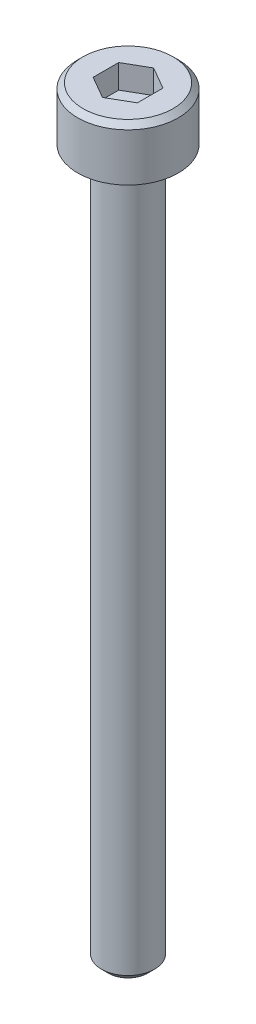
ISO-10303-21;
HEADER;
FILE_DESCRIPTION(('STEP AP214'),'2;1');
FILE_NAME('part.step','',(''),(''),'','','');
FILE_SCHEMA(('AUTOMOTIVE_DESIGN { 1 0 10303 214 1 1 1 1 }'));
ENDSEC;
DATA;
#1=APPLICATION_CONTEXT('core data for automotive mechanical design processes');
#2=APPLICATION_PROTOCOL_DEFINITION('international standard','automotive_design',2000,#1);
#3=PRODUCT_CONTEXT('',#1,'mechanical');
#4=PRODUCT('Part','Part','',(#3));
#5=PRODUCT_RELATED_PRODUCT_CATEGORY('part','',(#4));
#6=PRODUCT_DEFINITION_FORMATION('','',#4);
#7=PRODUCT_DEFINITION_CONTEXT('part definition',#1,'design');
#8=PRODUCT_DEFINITION('design','',#6,#7);
#9=PRODUCT_DEFINITION_SHAPE('','',#8);
#10=(LENGTH_UNIT() NAMED_UNIT(*) SI_UNIT(.MILLI.,.METRE.));
#11=(NAMED_UNIT(*) PLANE_ANGLE_UNIT() SI_UNIT($,.RADIAN.));
#12=(NAMED_UNIT(*) SI_UNIT($,.STERADIAN.) SOLID_ANGLE_UNIT());
#13=UNCERTAINTY_MEASURE_WITH_UNIT(LENGTH_MEASURE(1.E-05),#10,'distance_accuracy_value','');
#14=(GEOMETRIC_REPRESENTATION_CONTEXT(3) GLOBAL_UNCERTAINTY_ASSIGNED_CONTEXT((#13)) GLOBAL_UNIT_ASSIGNED_CONTEXT((#10,
#11,#12)) REPRESENTATION_CONTEXT('',''));
#15=CARTESIAN_POINT('',(0.,0.,0.));
#16=DIRECTION('',(0.,0.,1.));
#17=DIRECTION('',(1.,0.,0.));
#18=AXIS2_PLACEMENT_3D('',#15,#16,#17);
#19=CARTESIAN_POINT('',(0.,-40.,0.));
#20=DIRECTION('',(0.,-1.,0.));
#21=DIRECTION('',(0.,0.,-1.));
#22=AXIS2_PLACEMENT_3D('',#19,#20,#21);
#23=PLANE('',#22);
#24=CARTESIAN_POINT('',(0.,-40.,0.));
#25=DIRECTION('',(0.,-1.,0.));
#26=DIRECTION('',(0.,0.,-1.));
#27=AXIS2_PLACEMENT_3D('',#24,#25,#26);
#28=CIRCLE('',#27,1.1);
#29=CARTESIAN_POINT('',(0.,-40.,-1.1));
#30=VERTEX_POINT('',#29);
#31=EDGE_CURVE('E11',#30,#30,#28,.T.);
#32=ORIENTED_EDGE('',*,*,#31,.T.);
#33=EDGE_LOOP('',(#32));
#34=FACE_BOUND('',#33,.T.);
#35=ADVANCED_FACE('F41',(#34),#23,.T.);
#36=CARTESIAN_POINT('',(0.,-40.,0.));
#37=DIRECTION('',(0.,1.,0.));
#38=DIRECTION('',(0.,0.,1.));
#39=AXIS2_PLACEMENT_3D('',#36,#37,#38);
#40=CONICAL_SURFACE('',#39,1.1,0.785398163397451);
#41=CARTESIAN_POINT('',(0.,-39.6,0.));
#42=DIRECTION('',(0.,-1.,0.));
#43=DIRECTION('',(0.,0.,-1.));
#44=AXIS2_PLACEMENT_3D('',#41,#42,#43);
#45=CIRCLE('',#44,1.5);
#46=CARTESIAN_POINT('',(0.,-39.6,-1.5));
#47=VERTEX_POINT('',#46);
#48=EDGE_CURVE('E48',#47,#47,#45,.T.);
#49=ORIENTED_EDGE('',*,*,#48,.T.);
#50=EDGE_LOOP('',(#49));
#51=FACE_BOUND('',#50,.T.);
#52=ORIENTED_EDGE('',*,*,#31,.F.);
#53=EDGE_LOOP('',(#52));
#54=FACE_BOUND('',#53,.T.);
#55=ADVANCED_FACE('F161',(#51,#54),#40,.T.);
#56=CARTESIAN_POINT('',(0.,-10.,0.));
#57=DIRECTION('',(0.,-1.,0.));
#58=DIRECTION('',(0.,0.,-1.));
#59=AXIS2_PLACEMENT_3D('',#56,#57,#58);
#60=CYLINDRICAL_SURFACE('',#59,1.5);
#61=CARTESIAN_POINT('',(0.,0.,0.));
#62=DIRECTION('',(0.,-1.,0.));
#63=DIRECTION('',(0.,0.,-1.));
#64=AXIS2_PLACEMENT_3D('',#61,#62,#63);
#65=CIRCLE('',#64,1.5);
#66=CARTESIAN_POINT('',(0.,0.,-1.5));
#67=VERTEX_POINT('',#66);
#68=EDGE_CURVE('E156',#67,#67,#65,.T.);
#69=ORIENTED_EDGE('',*,*,#68,.T.);
#70=EDGE_LOOP('',(#69));
#71=FACE_BOUND('',#70,.T.);
#72=ORIENTED_EDGE('',*,*,#48,.F.);
#73=EDGE_LOOP('',(#72));
#74=FACE_BOUND('',#73,.T.);
#75=ADVANCED_FACE('F164',(#71,#74),#60,.T.);
#76=CARTESIAN_POINT('',(1.5,0.,0.));
#77=DIRECTION('',(0.,-1.,0.));
#78=DIRECTION('',(0.,0.,-1.));
#79=AXIS2_PLACEMENT_3D('',#76,#77,#78);
#80=PLANE('',#79);
#81=CARTESIAN_POINT('',(0.,0.,0.));
#82=DIRECTION('',(0.,-1.,0.));
#83=DIRECTION('',(0.,0.,-1.));
#84=AXIS2_PLACEMENT_3D('',#81,#82,#83);
#85=CIRCLE('',#84,2.84);
#86=CARTESIAN_POINT('',(0.,0.,-2.84));
#87=VERTEX_POINT('',#86);
#88=EDGE_CURVE('E153',#87,#87,#85,.T.);
#89=ORIENTED_EDGE('',*,*,#88,.T.);
#90=EDGE_LOOP('',(#89));
#91=FACE_BOUND('',#90,.T.);
#92=ORIENTED_EDGE('',*,*,#68,.F.);
#93=EDGE_LOOP('',(#92));
#94=FACE_BOUND('',#93,.T.);
#95=ADVANCED_FACE('F166',(#91,#94),#80,.T.);
#96=CARTESIAN_POINT('',(0.,-10.,0.));
#97=DIRECTION('',(0.,-1.,0.));
#98=DIRECTION('',(0.,0.,-1.));
#99=AXIS2_PLACEMENT_3D('',#96,#97,#98);
#100=CYLINDRICAL_SURFACE('',#99,2.84);
#101=CARTESIAN_POINT('',(0.,2.7,0.));
#102=DIRECTION('',(0.,-1.,0.));
#103=DIRECTION('',(0.,0.,-1.));
#104=AXIS2_PLACEMENT_3D('',#101,#102,#103);
#105=CIRCLE('',#104,2.84);
#106=CARTESIAN_POINT('',(0.,2.7,-2.84));
#107=VERTEX_POINT('',#106);
#108=EDGE_CURVE('E150',#107,#107,#105,.T.);
#109=ORIENTED_EDGE('',*,*,#108,.T.);
#110=EDGE_LOOP('',(#109));
#111=FACE_BOUND('',#110,.T.);
#112=ORIENTED_EDGE('',*,*,#88,.F.);
#113=EDGE_LOOP('',(#112));
#114=FACE_BOUND('',#113,.T.);
#115=ADVANCED_FACE('F172',(#111,#114),#100,.T.);
#116=CARTESIAN_POINT('',(0.,2.7,0.));
#117=DIRECTION('',(0.,-1.,0.));
#118=DIRECTION('',(0.,0.,-1.));
#119=AXIS2_PLACEMENT_3D('',#116,#117,#118);
#120=CONICAL_SURFACE('',#119,2.84,0.785398163397445);
#121=CARTESIAN_POINT('',(0.,3.,0.));
#122=DIRECTION('',(0.,-1.,0.));
#123=DIRECTION('',(0.,0.,-1.));
#124=AXIS2_PLACEMENT_3D('',#121,#122,#123);
#125=CIRCLE('',#124,2.54);
#126=CARTESIAN_POINT('',(0.,3.,-2.54));
#127=VERTEX_POINT('',#126);
#128=EDGE_CURVE('E142',#127,#127,#125,.T.);
#129=ORIENTED_EDGE('',*,*,#128,.T.);
#130=EDGE_LOOP('',(#129));
#131=FACE_BOUND('',#130,.T.);
#132=ORIENTED_EDGE('',*,*,#108,.F.);
#133=EDGE_LOOP('',(#132));
#134=FACE_BOUND('',#133,.T.);
#135=ADVANCED_FACE('F207',(#131,#134),#120,.T.);
#136=CARTESIAN_POINT('',(2.54,3.,0.));
#137=DIRECTION('',(0.,1.,0.));
#138=DIRECTION('',(0.,0.,1.));
#139=AXIS2_PLACEMENT_3D('',#136,#137,#138);
#140=PLANE('',#139);
#141=DIRECTION('',(0.,0.,-1.));
#142=VECTOR('',#141,1.);
#143=CARTESIAN_POINT('',(1.25,3.,-0.721687836487032));
#144=LINE('',#143,#142);
#145=CARTESIAN_POINT('',(1.25,3.,0.721687836487032));
#146=VERTEX_POINT('',#145);
#147=CARTESIAN_POINT('',(1.25,3.,-0.721687836487032));
#148=VERTEX_POINT('',#147);
#149=EDGE_CURVE('E55',#146,#148,#144,.T.);
#150=ORIENTED_EDGE('',*,*,#149,.F.);
#151=DIRECTION('',(0.866025403784439,0.,-0.5));
#152=VECTOR('',#151,1.);
#153=CARTESIAN_POINT('',(1.25,3.,0.721687836487032));
#154=LINE('',#153,#152);
#155=CARTESIAN_POINT('',(0.,3.,1.44337567297406));
#156=VERTEX_POINT('',#155);
#157=EDGE_CURVE('E138',#156,#146,#154,.T.);
#158=ORIENTED_EDGE('',*,*,#157,.F.);
#159=DIRECTION('',(0.866025403784439,0.,0.5));
#160=VECTOR('',#159,1.);
#161=CARTESIAN_POINT('',(0.,3.,1.44337567297406));
#162=LINE('',#161,#160);
#163=CARTESIAN_POINT('',(-1.25,3.,0.721687836487033));
#164=VERTEX_POINT('',#163);
#165=EDGE_CURVE('E136',#164,#156,#162,.T.);
#166=ORIENTED_EDGE('',*,*,#165,.F.);
#167=DIRECTION('',(0.,0.,1.));
#168=VECTOR('',#167,1.);
#169=CARTESIAN_POINT('',(-1.25,3.,0.721687836487033));
#170=LINE('',#169,#168);
#171=CARTESIAN_POINT('',(-1.25,3.,-0.721687836487032));
#172=VERTEX_POINT('',#171);
#173=EDGE_CURVE('E103',#172,#164,#170,.T.);
#174=ORIENTED_EDGE('',*,*,#173,.F.);
#175=DIRECTION('',(-0.866025403784438,0.,0.5));
#176=VECTOR('',#175,1.);
#177=CARTESIAN_POINT('',(-1.25,3.,-0.721687836487032));
#178=LINE('',#177,#176);
#179=CARTESIAN_POINT('',(0.,3.,-1.44337567297406));
#180=VERTEX_POINT('',#179);
#181=EDGE_CURVE('E132',#180,#172,#178,.T.);
#182=ORIENTED_EDGE('',*,*,#181,.F.);
#183=DIRECTION('',(-0.866025403784439,0.,-0.5));
#184=VECTOR('',#183,1.);
#185=CARTESIAN_POINT('',(0.,3.,-1.44337567297406));
#186=LINE('',#185,#184);
#187=EDGE_CURVE('E129',#148,#180,#186,.T.);
#188=ORIENTED_EDGE('',*,*,#187,.F.);
#189=EDGE_LOOP('',(#150,#158,#166,#174,#182,#188));
#190=FACE_BOUND('',#189,.T.);
#191=ORIENTED_EDGE('',*,*,#128,.F.);
#192=EDGE_LOOP('',(#191));
#193=FACE_BOUND('',#192,.T.);
#194=ADVANCED_FACE('F216',(#190,#193),#140,.T.);
#195=CARTESIAN_POINT('',(1.25,1.65,-0.721687836487032));
#196=DIRECTION('',(1.,0.,0.));
#197=DIRECTION('',(0.,0.,-1.));
#198=AXIS2_PLACEMENT_3D('',#195,#196,#197);
#199=PLANE('',#198);
#200=ORIENTED_EDGE('',*,*,#149,.T.);
#201=DIRECTION('',(0.,1.,0.));
#202=VECTOR('',#201,1.);
#203=CARTESIAN_POINT('',(1.25,1.65,-0.721687836487032));
#204=LINE('',#203,#202);
#205=CARTESIAN_POINT('',(1.25,1.65,-0.721687836487032));
#206=VERTEX_POINT('',#205);
#207=EDGE_CURVE('E85',#206,#148,#204,.T.);
#208=ORIENTED_EDGE('',*,*,#207,.F.);
#209=DIRECTION('',(0.,0.,-1.));
#210=VECTOR('',#209,1.);
#211=CARTESIAN_POINT('',(1.25,1.65,-0.721687836487032));
#212=LINE('',#211,#210);
#213=CARTESIAN_POINT('',(1.25,1.65,0.721687836487032));
#214=VERTEX_POINT('',#213);
#215=EDGE_CURVE('E140',#214,#206,#212,.T.);
#216=ORIENTED_EDGE('',*,*,#215,.F.);
#217=DIRECTION('',(0.,1.,0.));
#218=VECTOR('',#217,1.);
#219=CARTESIAN_POINT('',(1.25,1.65,0.721687836487032));
#220=LINE('',#219,#218);
#221=EDGE_CURVE('E63',#214,#146,#220,.T.);
#222=ORIENTED_EDGE('',*,*,#221,.T.);
#223=EDGE_LOOP('',(#200,#208,#216,#222));
#224=FACE_BOUND('',#223,.T.);
#225=ADVANCED_FACE('F225',(#224),#199,.F.);
#226=CARTESIAN_POINT('',(1.25,1.65,0.721687836487032));
#227=DIRECTION('',(0.5,0.,0.866025403784439));
#228=DIRECTION('',(0.866025403784439,0.,-0.5));
#229=AXIS2_PLACEMENT_3D('',#226,#227,#228);
#230=PLANE('',#229);
#231=ORIENTED_EDGE('',*,*,#157,.T.);
#232=ORIENTED_EDGE('',*,*,#221,.F.);
#233=DIRECTION('',(0.866025403784439,0.,-0.5));
#234=VECTOR('',#233,1.);
#235=CARTESIAN_POINT('',(1.25,1.65,0.721687836487032));
#236=LINE('',#235,#234);
#237=CARTESIAN_POINT('',(0.,1.65,1.44337567297406));
#238=VERTEX_POINT('',#237);
#239=EDGE_CURVE('E115',#238,#214,#236,.T.);
#240=ORIENTED_EDGE('',*,*,#239,.F.);
#241=DIRECTION('',(0.,1.,0.));
#242=VECTOR('',#241,1.);
#243=CARTESIAN_POINT('',(0.,1.65,1.44337567297406));
#244=LINE('',#243,#242);
#245=EDGE_CURVE('E107',#238,#156,#244,.T.);
#246=ORIENTED_EDGE('',*,*,#245,.T.);
#247=EDGE_LOOP('',(#231,#232,#240,#246));
#248=FACE_BOUND('',#247,.T.);
#249=ADVANCED_FACE('F234',(#248),#230,.F.);
#250=CARTESIAN_POINT('',(0.,1.65,1.44337567297406));
#251=DIRECTION('',(-0.5,0.,0.866025403784439));
#252=DIRECTION('',(0.866025403784439,0.,0.5));
#253=AXIS2_PLACEMENT_3D('',#250,#251,#252);
#254=PLANE('',#253);
#255=ORIENTED_EDGE('',*,*,#165,.T.);
#256=ORIENTED_EDGE('',*,*,#245,.F.);
#257=DIRECTION('',(0.866025403784439,0.,0.5));
#258=VECTOR('',#257,1.);
#259=CARTESIAN_POINT('',(0.,1.65,1.44337567297406));
#260=LINE('',#259,#258);
#261=CARTESIAN_POINT('',(-1.25,1.65,0.721687836487033));
#262=VERTEX_POINT('',#261);
#263=EDGE_CURVE('E111',#262,#238,#260,.T.);
#264=ORIENTED_EDGE('',*,*,#263,.F.);
#265=DIRECTION('',(0.,1.,0.));
#266=VECTOR('',#265,1.);
#267=CARTESIAN_POINT('',(-1.25,1.65,0.721687836487033));
#268=LINE('',#267,#266);
#269=EDGE_CURVE('E96',#262,#164,#268,.T.);
#270=ORIENTED_EDGE('',*,*,#269,.T.);
#271=EDGE_LOOP('',(#255,#256,#264,#270));
#272=FACE_BOUND('',#271,.T.);
#273=ADVANCED_FACE('F112',(#272),#254,.F.);
#274=CARTESIAN_POINT('',(-1.25,1.65,0.721687836487033));
#275=DIRECTION('',(-1.,0.,0.));
#276=DIRECTION('',(0.,0.,1.));
#277=AXIS2_PLACEMENT_3D('',#274,#275,#276);
#278=PLANE('',#277);
#279=ORIENTED_EDGE('',*,*,#173,.T.);
#280=ORIENTED_EDGE('',*,*,#269,.F.);
#281=DIRECTION('',(0.,0.,1.));
#282=VECTOR('',#281,1.);
#283=CARTESIAN_POINT('',(-1.25,1.65,0.721687836487033));
#284=LINE('',#283,#282);
#285=CARTESIAN_POINT('',(-1.25,1.65,-0.721687836487032));
#286=VERTEX_POINT('',#285);
#287=EDGE_CURVE('E100',#286,#262,#284,.T.);
#288=ORIENTED_EDGE('',*,*,#287,.F.);
#289=DIRECTION('',(0.,1.,0.));
#290=VECTOR('',#289,1.);
#291=CARTESIAN_POINT('',(-1.25,1.65,-0.721687836487032));
#292=LINE('',#291,#290);
#293=EDGE_CURVE('E108',#286,#172,#292,.T.);
#294=ORIENTED_EDGE('',*,*,#293,.T.);
#295=EDGE_LOOP('',(#279,#280,#288,#294));
#296=FACE_BOUND('',#295,.T.);
#297=ADVANCED_FACE('F98',(#296),#278,.F.);
#298=CARTESIAN_POINT('',(-1.25,1.65,-0.721687836487032));
#299=DIRECTION('',(-0.5,0.,-0.866025403784438));
#300=DIRECTION('',(-0.866025403784439,0.,0.5));
#301=AXIS2_PLACEMENT_3D('',#298,#299,#300);
#302=PLANE('',#301);
#303=ORIENTED_EDGE('',*,*,#181,.T.);
#304=ORIENTED_EDGE('',*,*,#293,.F.);
#305=DIRECTION('',(-0.866025403784438,0.,0.5));
#306=VECTOR('',#305,1.);
#307=CARTESIAN_POINT('',(-1.25,1.65,-0.721687836487032));
#308=LINE('',#307,#306);
#309=CARTESIAN_POINT('',(0.,1.65,-1.44337567297406));
#310=VERTEX_POINT('',#309);
#311=EDGE_CURVE('E121',#310,#286,#308,.T.);
#312=ORIENTED_EDGE('',*,*,#311,.F.);
#313=DIRECTION('',(0.,1.,0.));
#314=VECTOR('',#313,1.);
#315=CARTESIAN_POINT('',(0.,1.65,-1.44337567297406));
#316=LINE('',#315,#314);
#317=EDGE_CURVE('E145',#310,#180,#316,.T.);
#318=ORIENTED_EDGE('',*,*,#317,.T.);
#319=EDGE_LOOP('',(#303,#304,#312,#318));
#320=FACE_BOUND('',#319,.T.);
#321=ADVANCED_FACE('F256',(#320),#302,.F.);
#322=CARTESIAN_POINT('',(0.,1.65,-1.44337567297406));
#323=DIRECTION('',(0.5,0.,-0.866025403784439));
#324=DIRECTION('',(-0.866025403784439,0.,-0.5));
#325=AXIS2_PLACEMENT_3D('',#322,#323,#324);
#326=PLANE('',#325);
#327=ORIENTED_EDGE('',*,*,#187,.T.);
#328=ORIENTED_EDGE('',*,*,#317,.F.);
#329=DIRECTION('',(-0.866025403784439,0.,-0.5));
#330=VECTOR('',#329,1.);
#331=CARTESIAN_POINT('',(0.,1.65,-1.44337567297406));
#332=LINE('',#331,#330);
#333=EDGE_CURVE('E123',#206,#310,#332,.T.);
#334=ORIENTED_EDGE('',*,*,#333,.F.);
#335=ORIENTED_EDGE('',*,*,#207,.T.);
#336=EDGE_LOOP('',(#327,#328,#334,#335));
#337=FACE_BOUND('',#336,.T.);
#338=ADVANCED_FACE('F264',(#337),#326,.F.);
#339=CARTESIAN_POINT('',(0.,1.65,0.));
#340=DIRECTION('',(0.,-1.,0.));
#341=DIRECTION('',(0.,0.,-1.));
#342=AXIS2_PLACEMENT_3D('',#339,#340,#341);
#343=PLANE('',#342);
#344=ORIENTED_EDGE('',*,*,#215,.T.);
#345=ORIENTED_EDGE('',*,*,#333,.T.);
#346=ORIENTED_EDGE('',*,*,#311,.T.);
#347=ORIENTED_EDGE('',*,*,#287,.T.);
#348=ORIENTED_EDGE('',*,*,#263,.T.);
#349=ORIENTED_EDGE('',*,*,#239,.T.);
#350=EDGE_LOOP('',(#344,#345,#346,#347,#348,#349));
#351=FACE_BOUND('',#350,.T.);
#352=ADVANCED_FACE('F118',(#351),#343,.F.);
#353=CLOSED_SHELL('',(#35,#55,#75,#95,#115,#135,#194,#225,#249,#273,#297,#321,#338,#352));
#354=MANIFOLD_SOLID_BREP('B2',#353);
#355=ADVANCED_BREP_SHAPE_REPRESENTATION('',(#18,#354),#14);
#356=SHAPE_DEFINITION_REPRESENTATION(#9,#355);
ENDSEC;
END-ISO-10303-21;
